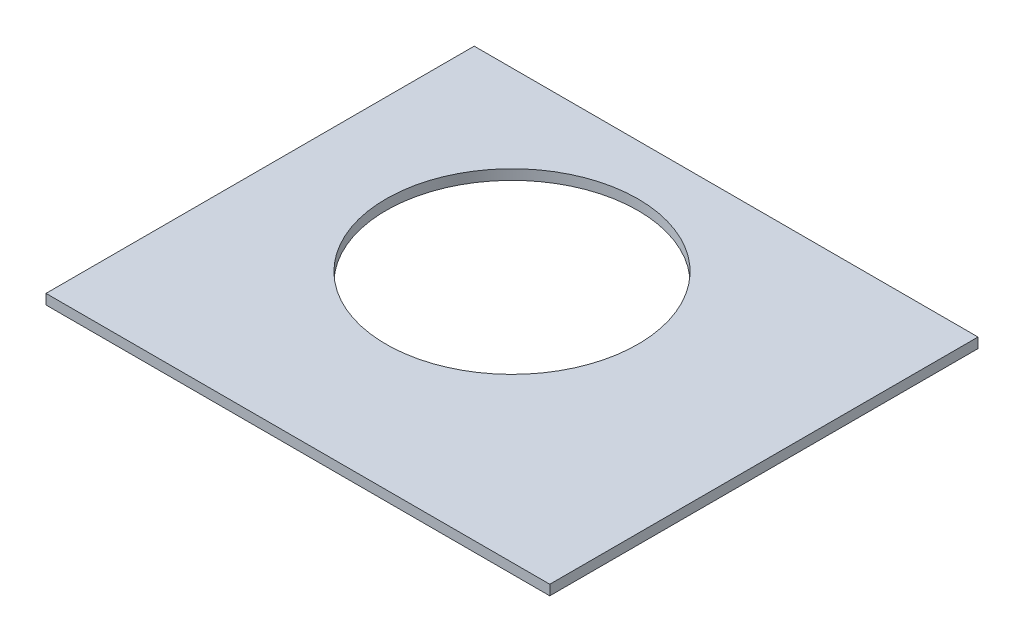
ISO-10303-21;
HEADER;
FILE_DESCRIPTION(('STEP AP214'),'2;1');
FILE_NAME('part.step','',(''),(''),'','','');
FILE_SCHEMA(('AUTOMOTIVE_DESIGN { 1 0 10303 214 1 1 1 1 }'));
ENDSEC;
DATA;
#1=APPLICATION_CONTEXT('core data for automotive mechanical design processes');
#2=APPLICATION_PROTOCOL_DEFINITION('international standard','automotive_design',2000,#1);
#3=PRODUCT_CONTEXT('',#1,'mechanical');
#4=PRODUCT('Part','Part','',(#3));
#5=PRODUCT_RELATED_PRODUCT_CATEGORY('part','',(#4));
#6=PRODUCT_DEFINITION_FORMATION('','',#4);
#7=PRODUCT_DEFINITION_CONTEXT('part definition',#1,'design');
#8=PRODUCT_DEFINITION('design','',#6,#7);
#9=PRODUCT_DEFINITION_SHAPE('','',#8);
#10=(LENGTH_UNIT() NAMED_UNIT(*) SI_UNIT(.MILLI.,.METRE.));
#11=(NAMED_UNIT(*) PLANE_ANGLE_UNIT() SI_UNIT($,.RADIAN.));
#12=(NAMED_UNIT(*) SI_UNIT($,.STERADIAN.) SOLID_ANGLE_UNIT());
#13=UNCERTAINTY_MEASURE_WITH_UNIT(LENGTH_MEASURE(1.E-05),#10,'distance_accuracy_value','');
#14=(GEOMETRIC_REPRESENTATION_CONTEXT(3) GLOBAL_UNCERTAINTY_ASSIGNED_CONTEXT((#13)) GLOBAL_UNIT_ASSIGNED_CONTEXT((#10,
#11,#12)) REPRESENTATION_CONTEXT('',''));
#15=CARTESIAN_POINT('',(0.,0.,0.));
#16=DIRECTION('',(0.,0.,1.));
#17=DIRECTION('',(1.,0.,0.));
#18=AXIS2_PLACEMENT_3D('',#15,#16,#17);
#19=CARTESIAN_POINT('',(0.,4.,0.));
#20=DIRECTION('',(1.,0.,0.));
#21=DIRECTION('',(0.,0.,-1.));
#22=AXIS2_PLACEMENT_3D('',#19,#20,#21);
#23=PLANE('',#22);
#24=DIRECTION('',(0.,0.,1.));
#25=VECTOR('',#24,1.);
#26=CARTESIAN_POINT('',(0.,0.,0.));
#27=LINE('',#26,#25);
#28=CARTESIAN_POINT('',(0.,0.,-170.));
#29=VERTEX_POINT('',#28);
#30=CARTESIAN_POINT('',(0.,0.,0.));
#31=VERTEX_POINT('',#30);
#32=EDGE_CURVE('E98',#29,#31,#27,.T.);
#33=ORIENTED_EDGE('',*,*,#32,.T.);
#34=DIRECTION('',(0.,-1.,0.));
#35=VECTOR('',#34,1.);
#36=CARTESIAN_POINT('',(0.,4.,0.));
#37=LINE('',#36,#35);
#38=CARTESIAN_POINT('',(0.,4.,0.));
#39=VERTEX_POINT('',#38);
#40=EDGE_CURVE('E11',#39,#31,#37,.T.);
#41=ORIENTED_EDGE('',*,*,#40,.F.);
#42=DIRECTION('',(0.,0.,1.));
#43=VECTOR('',#42,1.);
#44=CARTESIAN_POINT('',(0.,4.,0.));
#45=LINE('',#44,#43);
#46=CARTESIAN_POINT('',(0.,4.,-170.));
#47=VERTEX_POINT('',#46);
#48=EDGE_CURVE('E86',#47,#39,#45,.T.);
#49=ORIENTED_EDGE('',*,*,#48,.F.);
#50=DIRECTION('',(0.,-1.,0.));
#51=VECTOR('',#50,1.);
#52=CARTESIAN_POINT('',(0.,4.,-170.));
#53=LINE('',#52,#51);
#54=EDGE_CURVE('E94',#47,#29,#53,.T.);
#55=ORIENTED_EDGE('',*,*,#54,.T.);
#56=EDGE_LOOP('',(#33,#41,#49,#55));
#57=FACE_BOUND('',#56,.T.);
#58=ADVANCED_FACE('F35',(#57),#23,.F.);
#59=CARTESIAN_POINT('',(0.,4.,0.));
#60=DIRECTION('',(0.,0.,-1.));
#61=DIRECTION('',(-1.,0.,0.));
#62=AXIS2_PLACEMENT_3D('',#59,#60,#61);
#63=PLANE('',#62);
#64=DIRECTION('',(1.,0.,0.));
#65=VECTOR('',#64,1.);
#66=CARTESIAN_POINT('',(0.,0.,0.));
#67=LINE('',#66,#65);
#68=CARTESIAN_POINT('',(200.,0.,0.));
#69=VERTEX_POINT('',#68);
#70=EDGE_CURVE('E90',#31,#69,#67,.T.);
#71=ORIENTED_EDGE('',*,*,#70,.T.);
#72=DIRECTION('',(0.,-1.,0.));
#73=VECTOR('',#72,1.);
#74=CARTESIAN_POINT('',(200.,4.,0.));
#75=LINE('',#74,#73);
#76=CARTESIAN_POINT('',(200.,4.,0.));
#77=VERTEX_POINT('',#76);
#78=EDGE_CURVE('E43',#77,#69,#75,.T.);
#79=ORIENTED_EDGE('',*,*,#78,.F.);
#80=DIRECTION('',(1.,0.,0.));
#81=VECTOR('',#80,1.);
#82=CARTESIAN_POINT('',(0.,4.,0.));
#83=LINE('',#82,#81);
#84=EDGE_CURVE('E81',#39,#77,#83,.T.);
#85=ORIENTED_EDGE('',*,*,#84,.F.);
#86=ORIENTED_EDGE('',*,*,#40,.T.);
#87=EDGE_LOOP('',(#71,#79,#85,#86));
#88=FACE_BOUND('',#87,.T.);
#89=ADVANCED_FACE('F89',(#88),#63,.F.);
#90=CARTESIAN_POINT('',(200.,4.,0.));
#91=DIRECTION('',(-1.,0.,0.));
#92=DIRECTION('',(0.,0.,1.));
#93=AXIS2_PLACEMENT_3D('',#90,#91,#92);
#94=PLANE('',#93);
#95=DIRECTION('',(0.,0.,-1.));
#96=VECTOR('',#95,1.);
#97=CARTESIAN_POINT('',(200.,0.,0.));
#98=LINE('',#97,#96);
#99=CARTESIAN_POINT('',(200.,0.,-170.));
#100=VERTEX_POINT('',#99);
#101=EDGE_CURVE('E68',#69,#100,#98,.T.);
#102=ORIENTED_EDGE('',*,*,#101,.T.);
#103=DIRECTION('',(0.,-1.,0.));
#104=VECTOR('',#103,1.);
#105=CARTESIAN_POINT('',(200.,4.,-170.));
#106=LINE('',#105,#104);
#107=CARTESIAN_POINT('',(200.,4.,-170.));
#108=VERTEX_POINT('',#107);
#109=EDGE_CURVE('E91',#108,#100,#106,.T.);
#110=ORIENTED_EDGE('',*,*,#109,.F.);
#111=DIRECTION('',(0.,0.,-1.));
#112=VECTOR('',#111,1.);
#113=CARTESIAN_POINT('',(200.,4.,0.));
#114=LINE('',#113,#112);
#115=EDGE_CURVE('E84',#77,#108,#114,.T.);
#116=ORIENTED_EDGE('',*,*,#115,.F.);
#117=ORIENTED_EDGE('',*,*,#78,.T.);
#118=EDGE_LOOP('',(#102,#110,#116,#117));
#119=FACE_BOUND('',#118,.T.);
#120=ADVANCED_FACE('F92',(#119),#94,.F.);
#121=CARTESIAN_POINT('',(0.,4.,-170.));
#122=DIRECTION('',(0.,0.,1.));
#123=DIRECTION('',(1.,0.,0.));
#124=AXIS2_PLACEMENT_3D('',#121,#122,#123);
#125=PLANE('',#124);
#126=DIRECTION('',(-1.,0.,0.));
#127=VECTOR('',#126,1.);
#128=CARTESIAN_POINT('',(0.,0.,-170.));
#129=LINE('',#128,#127);
#130=EDGE_CURVE('E74',#100,#29,#129,.T.);
#131=ORIENTED_EDGE('',*,*,#130,.T.);
#132=ORIENTED_EDGE('',*,*,#54,.F.);
#133=DIRECTION('',(-1.,0.,0.));
#134=VECTOR('',#133,1.);
#135=CARTESIAN_POINT('',(0.,4.,-170.));
#136=LINE('',#135,#134);
#137=EDGE_CURVE('E51',#108,#47,#136,.T.);
#138=ORIENTED_EDGE('',*,*,#137,.F.);
#139=ORIENTED_EDGE('',*,*,#109,.T.);
#140=EDGE_LOOP('',(#131,#132,#138,#139));
#141=FACE_BOUND('',#140,.T.);
#142=ADVANCED_FACE('F106',(#141),#125,.F.);
#143=CARTESIAN_POINT('',(0.,4.,0.));
#144=DIRECTION('',(0.,-1.,0.));
#145=DIRECTION('',(0.,0.,-1.));
#146=AXIS2_PLACEMENT_3D('',#143,#144,#145);
#147=PLANE('',#146);
#148=CARTESIAN_POINT('',(85.,4.,-100.));
#149=DIRECTION('',(0.,-1.,0.));
#150=DIRECTION('',(0.,0.,-1.));
#151=AXIS2_PLACEMENT_3D('',#148,#149,#150);
#152=CIRCLE('',#151,50.);
#153=CARTESIAN_POINT('',(85.,4.,-150.));
#154=VERTEX_POINT('',#153);
#155=EDGE_CURVE('E101',#154,#154,#152,.F.);
#156=ORIENTED_EDGE('',*,*,#155,.F.);
#157=EDGE_LOOP('',(#156));
#158=FACE_BOUND('',#157,.T.);
#159=ORIENTED_EDGE('',*,*,#48,.T.);
#160=ORIENTED_EDGE('',*,*,#84,.T.);
#161=ORIENTED_EDGE('',*,*,#115,.T.);
#162=ORIENTED_EDGE('',*,*,#137,.T.);
#163=EDGE_LOOP('',(#159,#160,#161,#162));
#164=FACE_BOUND('',#163,.T.);
#165=ADVANCED_FACE('F82',(#158,#164),#147,.F.);
#166=CARTESIAN_POINT('',(0.,0.,0.));
#167=DIRECTION('',(0.,-1.,0.));
#168=DIRECTION('',(0.,0.,-1.));
#169=AXIS2_PLACEMENT_3D('',#166,#167,#168);
#170=PLANE('',#169);
#171=CARTESIAN_POINT('',(85.,0.,-100.));
#172=DIRECTION('',(0.,1.,0.));
#173=DIRECTION('',(0.,0.,1.));
#174=AXIS2_PLACEMENT_3D('',#171,#172,#173);
#175=CIRCLE('',#174,50.);
#176=CARTESIAN_POINT('',(85.,0.,-50.));
#177=VERTEX_POINT('',#176);
#178=EDGE_CURVE('E114',#177,#177,#175,.T.);
#179=ORIENTED_EDGE('',*,*,#178,.T.);
#180=EDGE_LOOP('',(#179));
#181=FACE_BOUND('',#180,.T.);
#182=ORIENTED_EDGE('',*,*,#32,.F.);
#183=ORIENTED_EDGE('',*,*,#130,.F.);
#184=ORIENTED_EDGE('',*,*,#101,.F.);
#185=ORIENTED_EDGE('',*,*,#70,.F.);
#186=EDGE_LOOP('',(#182,#183,#184,#185));
#187=FACE_BOUND('',#186,.T.);
#188=ADVANCED_FACE('F109',(#181,#187),#170,.T.);
#189=CARTESIAN_POINT('',(85.,6.,-100.));
#190=DIRECTION('',(0.,-1.,0.));
#191=DIRECTION('',(0.,0.,-1.));
#192=AXIS2_PLACEMENT_3D('',#189,#190,#191);
#193=CYLINDRICAL_SURFACE('',#192,50.);
#194=ORIENTED_EDGE('',*,*,#178,.F.);
#195=EDGE_LOOP('',(#194));
#196=FACE_BOUND('',#195,.T.);
#197=ORIENTED_EDGE('',*,*,#155,.T.);
#198=EDGE_LOOP('',(#197));
#199=FACE_BOUND('',#198,.T.);
#200=ADVANCED_FACE('F119',(#196,#199),#193,.F.);
#201=CLOSED_SHELL('',(#58,#89,#120,#142,#165,#188,#200));
#202=MANIFOLD_SOLID_BREP('B2',#201);
#203=ADVANCED_BREP_SHAPE_REPRESENTATION('',(#18,#202),#14);
#204=SHAPE_DEFINITION_REPRESENTATION(#9,#203);
ENDSEC;
END-ISO-10303-21;
